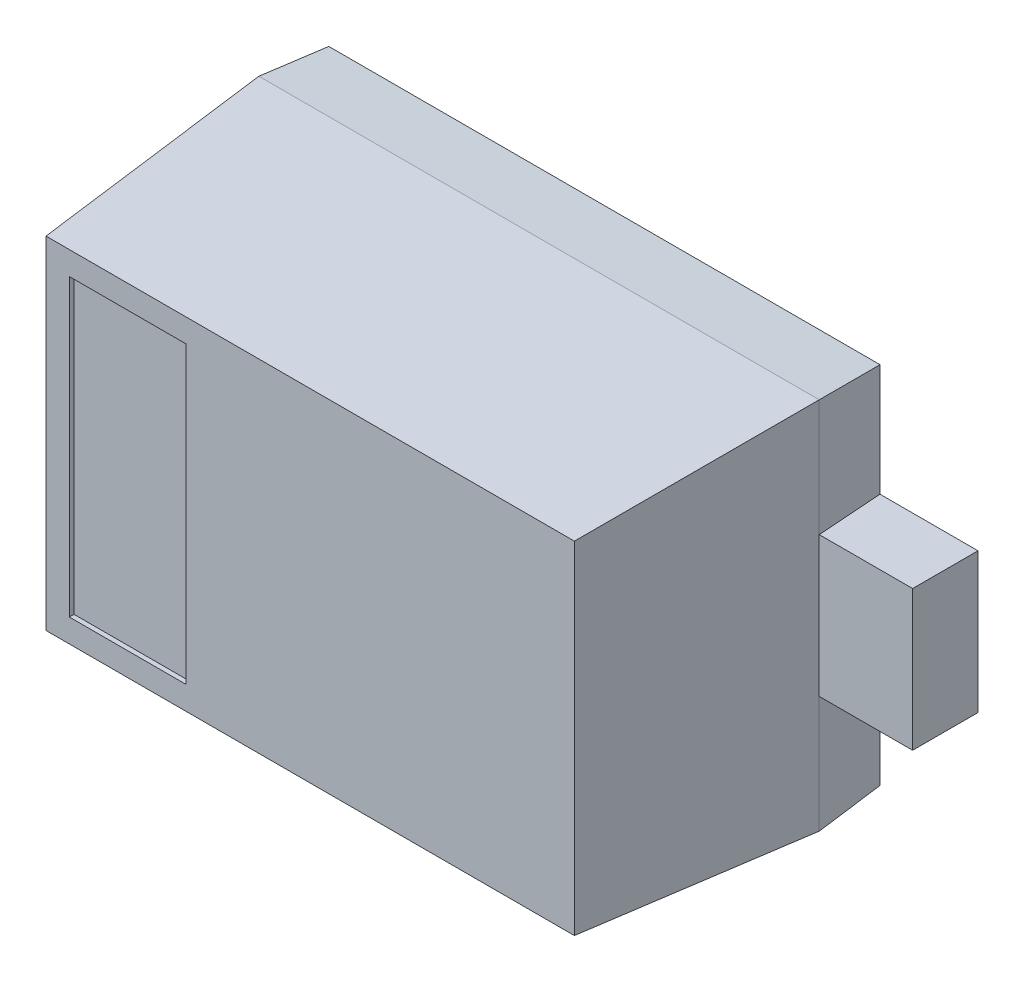
ISO-10303-21;
HEADER;
FILE_DESCRIPTION(('STEP AP214'),'2;1');
FILE_NAME('part.step','',(''),(''),'','','');
FILE_SCHEMA(('AUTOMOTIVE_DESIGN { 1 0 10303 214 1 1 1 1 }'));
ENDSEC;
DATA;
#1=APPLICATION_CONTEXT('core data for automotive mechanical design processes');
#2=APPLICATION_PROTOCOL_DEFINITION('international standard','automotive_design',2000,#1);
#3=PRODUCT_CONTEXT('',#1,'mechanical');
#4=PRODUCT('Part','Part','',(#3));
#5=PRODUCT_RELATED_PRODUCT_CATEGORY('part','',(#4));
#6=PRODUCT_DEFINITION_FORMATION('','',#4);
#7=PRODUCT_DEFINITION_CONTEXT('part definition',#1,'design');
#8=PRODUCT_DEFINITION('design','',#6,#7);
#9=PRODUCT_DEFINITION_SHAPE('','',#8);
#10=(LENGTH_UNIT() NAMED_UNIT(*) SI_UNIT(.MILLI.,.METRE.));
#11=(NAMED_UNIT(*) PLANE_ANGLE_UNIT() SI_UNIT($,.RADIAN.));
#12=(NAMED_UNIT(*) SI_UNIT($,.STERADIAN.) SOLID_ANGLE_UNIT());
#13=UNCERTAINTY_MEASURE_WITH_UNIT(LENGTH_MEASURE(1.E-05),#10,'distance_accuracy_value','');
#14=(GEOMETRIC_REPRESENTATION_CONTEXT(3) GLOBAL_UNCERTAINTY_ASSIGNED_CONTEXT((#13)) GLOBAL_UNIT_ASSIGNED_CONTEXT((#10,
#11,#12)) REPRESENTATION_CONTEXT('',''));
#15=CARTESIAN_POINT('',(0.,0.,0.));
#16=DIRECTION('',(0.,0.,1.));
#17=DIRECTION('',(1.,0.,0.));
#18=AXIS2_PLACEMENT_3D('',#15,#16,#17);
#19=CARTESIAN_POINT('',(-0.515735862148,-0.315735862148,0.62));
#20=DIRECTION('',(0.,0.,1.));
#21=DIRECTION('',(1.,0.,0.));
#22=AXIS2_PLACEMENT_3D('',#19,#20,#21);
#23=PLANE('',#22);
#24=DIRECTION('',(0.,1.,0.));
#25=VECTOR('',#24,1.);
#26=CARTESIAN_POINT('',(-0.265735862148,-0.315735862148,0.62));
#27=LINE('',#26,#25);
#28=CARTESIAN_POINT('',(-0.265735862148,-0.315735862148,0.62));
#29=VERTEX_POINT('',#28);
#30=CARTESIAN_POINT('',(-0.265735862148,0.315735862148,0.62));
#31=VERTEX_POINT('',#30);
#32=EDGE_CURVE('E133',#29,#31,#27,.T.);
#33=ORIENTED_EDGE('',*,*,#32,.T.);
#34=DIRECTION('',(1.,0.,0.));
#35=VECTOR('',#34,1.);
#36=CARTESIAN_POINT('',(-0.515735862148,0.315735862148,0.62));
#37=LINE('',#36,#35);
#38=CARTESIAN_POINT('',(-0.515735862148,0.315735862148,0.62));
#39=VERTEX_POINT('',#38);
#40=EDGE_CURVE('E130',#31,#39,#37,.F.);
#41=ORIENTED_EDGE('',*,*,#40,.T.);
#42=DIRECTION('',(0.,1.,0.));
#43=VECTOR('',#42,1.);
#44=CARTESIAN_POINT('',(-0.515735862148,-0.315735862148,0.62));
#45=LINE('',#44,#43);
#46=CARTESIAN_POINT('',(-0.515735862148,-0.315735862148,0.62));
#47=VERTEX_POINT('',#46);
#48=EDGE_CURVE('E152',#47,#39,#45,.T.);
#49=ORIENTED_EDGE('',*,*,#48,.F.);
#50=DIRECTION('',(1.,0.,0.));
#51=VECTOR('',#50,1.);
#52=CARTESIAN_POINT('',(-0.515735862148,-0.315735862148,0.62));
#53=LINE('',#52,#51);
#54=EDGE_CURVE('E136',#29,#47,#53,.F.);
#55=ORIENTED_EDGE('',*,*,#54,.F.);
#56=EDGE_LOOP('',(#33,#41,#49,#55));
#57=FACE_BOUND('',#56,.T.);
#58=ADVANCED_FACE('F16',(#57),#23,.T.);
#59=CARTESIAN_POINT('',(-0.265735862148,-0.315735862148,0.62));
#60=DIRECTION('',(1.,0.,0.));
#61=DIRECTION('',(0.,0.,-1.));
#62=AXIS2_PLACEMENT_3D('',#59,#60,#61);
#63=PLANE('',#62);
#64=DIRECTION('',(0.,0.,1.));
#65=VECTOR('',#64,1.);
#66=CARTESIAN_POINT('',(-0.265735862148,0.315735862148,0.62));
#67=LINE('',#66,#65);
#68=CARTESIAN_POINT('',(-0.265735862148,0.315735862148,0.63));
#69=VERTEX_POINT('',#68);
#70=EDGE_CURVE('E139',#69,#31,#67,.F.);
#71=ORIENTED_EDGE('',*,*,#70,.T.);
#72=ORIENTED_EDGE('',*,*,#32,.F.);
#73=DIRECTION('',(0.,0.,1.));
#74=VECTOR('',#73,1.);
#75=CARTESIAN_POINT('',(-0.265735862148,-0.315735862148,0.62));
#76=LINE('',#75,#74);
#77=CARTESIAN_POINT('',(-0.265735862148,-0.315735862148,0.63));
#78=VERTEX_POINT('',#77);
#79=EDGE_CURVE('E231',#78,#29,#76,.F.);
#80=ORIENTED_EDGE('',*,*,#79,.F.);
#81=DIRECTION('',(0.,1.,0.));
#82=VECTOR('',#81,1.);
#83=CARTESIAN_POINT('',(-0.265735862148,-0.365735862148,0.63));
#84=LINE('',#83,#82);
#85=EDGE_CURVE('E144',#78,#69,#84,.T.);
#86=ORIENTED_EDGE('',*,*,#85,.T.);
#87=EDGE_LOOP('',(#71,#72,#80,#86));
#88=FACE_BOUND('',#87,.T.);
#89=ADVANCED_FACE('F142',(#88),#63,.F.);
#90=CARTESIAN_POINT('',(-0.515735862148,0.315735862148,0.62));
#91=DIRECTION('',(0.,1.,0.));
#92=DIRECTION('',(0.,0.,1.));
#93=AXIS2_PLACEMENT_3D('',#90,#91,#92);
#94=PLANE('',#93);
#95=DIRECTION('',(0.,0.,-1.));
#96=VECTOR('',#95,1.);
#97=CARTESIAN_POINT('',(-0.515735862148,0.315735862148,0.62));
#98=LINE('',#97,#96);
#99=CARTESIAN_POINT('',(-0.515735862148,0.315735862148,0.63));
#100=VERTEX_POINT('',#99);
#101=EDGE_CURVE('E150',#39,#100,#98,.F.);
#102=ORIENTED_EDGE('',*,*,#101,.F.);
#103=ORIENTED_EDGE('',*,*,#40,.F.);
#104=ORIENTED_EDGE('',*,*,#70,.F.);
#105=DIRECTION('',(-1.,0.,0.));
#106=VECTOR('',#105,1.);
#107=CARTESIAN_POINT('',(-0.565735862148,0.315735862148,0.63));
#108=LINE('',#107,#106);
#109=EDGE_CURVE('E203',#69,#100,#108,.T.);
#110=ORIENTED_EDGE('',*,*,#109,.T.);
#111=EDGE_LOOP('',(#102,#103,#104,#110));
#112=FACE_BOUND('',#111,.T.);
#113=ADVANCED_FACE('F148',(#112),#94,.F.);
#114=CARTESIAN_POINT('',(-0.515735862148,-0.315735862148,0.62));
#115=DIRECTION('',(1.,0.,0.));
#116=DIRECTION('',(0.,0.,-1.));
#117=AXIS2_PLACEMENT_3D('',#114,#115,#116);
#118=PLANE('',#117);
#119=ORIENTED_EDGE('',*,*,#101,.T.);
#120=DIRECTION('',(0.,1.,0.));
#121=VECTOR('',#120,1.);
#122=CARTESIAN_POINT('',(-0.515735862148,-0.365735862148,0.63));
#123=LINE('',#122,#121);
#124=CARTESIAN_POINT('',(-0.515735862148,-0.315735862148,0.63));
#125=VERTEX_POINT('',#124);
#126=EDGE_CURVE('E201',#100,#125,#123,.F.);
#127=ORIENTED_EDGE('',*,*,#126,.T.);
#128=DIRECTION('',(0.,0.,1.));
#129=VECTOR('',#128,1.);
#130=CARTESIAN_POINT('',(-0.515735862148,-0.315735862148,0.62));
#131=LINE('',#130,#129);
#132=EDGE_CURVE('E206',#47,#125,#131,.T.);
#133=ORIENTED_EDGE('',*,*,#132,.F.);
#134=ORIENTED_EDGE('',*,*,#48,.T.);
#135=EDGE_LOOP('',(#119,#127,#133,#134));
#136=FACE_BOUND('',#135,.T.);
#137=ADVANCED_FACE('F234',(#136),#118,.T.);
#138=CARTESIAN_POINT('',(-0.515735862148,-0.315735862148,0.62));
#139=DIRECTION('',(0.,1.,0.));
#140=DIRECTION('',(0.,0.,1.));
#141=AXIS2_PLACEMENT_3D('',#138,#139,#140);
#142=PLANE('',#141);
#143=ORIENTED_EDGE('',*,*,#132,.T.);
#144=DIRECTION('',(-1.,0.,0.));
#145=VECTOR('',#144,1.);
#146=CARTESIAN_POINT('',(-0.565735862148,-0.315735862148,0.63));
#147=LINE('',#146,#145);
#148=EDGE_CURVE('E198',#125,#78,#147,.F.);
#149=ORIENTED_EDGE('',*,*,#148,.T.);
#150=ORIENTED_EDGE('',*,*,#79,.T.);
#151=ORIENTED_EDGE('',*,*,#54,.T.);
#152=EDGE_LOOP('',(#143,#149,#150,#151));
#153=FACE_BOUND('',#152,.T.);
#154=ADVANCED_FACE('F240',(#153),#142,.T.);
#155=CARTESIAN_POINT('',(-0.590210246328,0.15,0.14));
#156=DIRECTION('',(0.,0.,1.));
#157=DIRECTION('',(1.,0.,0.));
#158=AXIS2_PLACEMENT_3D('',#155,#156,#157);
#159=PLANE('',#158);
#160=DIRECTION('',(0.,-1.,0.));
#161=VECTOR('',#160,1.);
#162=CARTESIAN_POINT('',(-0.8,0.15,0.14));
#163=LINE('',#162,#161);
#164=CARTESIAN_POINT('',(-0.8,-0.15,0.14));
#165=VERTEX_POINT('',#164);
#166=CARTESIAN_POINT('',(-0.8,0.15,0.14));
#167=VERTEX_POINT('',#166);
#168=EDGE_CURVE('E194',#165,#167,#163,.F.);
#169=ORIENTED_EDGE('',*,*,#168,.F.);
#170=DIRECTION('',(1.,0.,0.));
#171=VECTOR('',#170,1.);
#172=CARTESIAN_POINT('',(-0.590210246328,-0.15,0.14));
#173=LINE('',#172,#171);
#174=CARTESIAN_POINT('',(-0.6,-0.15,0.14));
#175=VERTEX_POINT('',#174);
#176=EDGE_CURVE('E68',#175,#165,#173,.F.);
#177=ORIENTED_EDGE('',*,*,#176,.F.);
#178=DIRECTION('',(0.,-1.,0.));
#179=VECTOR('',#178,1.);
#180=CARTESIAN_POINT('',(-0.6,0.,0.14));
#181=LINE('',#180,#179);
#182=CARTESIAN_POINT('',(-0.6,0.15,0.14));
#183=VERTEX_POINT('',#182);
#184=EDGE_CURVE('E319',#183,#175,#181,.T.);
#185=ORIENTED_EDGE('',*,*,#184,.F.);
#186=DIRECTION('',(1.,0.,0.));
#187=VECTOR('',#186,1.);
#188=CARTESIAN_POINT('',(-0.590210246328,0.15,0.14));
#189=LINE('',#188,#187);
#190=EDGE_CURVE('E225',#183,#167,#189,.F.);
#191=ORIENTED_EDGE('',*,*,#190,.T.);
#192=EDGE_LOOP('',(#169,#177,#185,#191));
#193=FACE_BOUND('',#192,.T.);
#194=ADVANCED_FACE('F242',(#193),#159,.T.);
#195=CARTESIAN_POINT('',(0.590210246328,-0.15,0.14));
#196=DIRECTION('',(0.,0.,1.));
#197=DIRECTION('',(1.,0.,0.));
#198=AXIS2_PLACEMENT_3D('',#195,#196,#197);
#199=PLANE('',#198);
#200=DIRECTION('',(0.,1.,0.));
#201=VECTOR('',#200,1.);
#202=CARTESIAN_POINT('',(0.8,-0.15,0.14));
#203=LINE('',#202,#201);
#204=CARTESIAN_POINT('',(0.8,0.15,0.14));
#205=VERTEX_POINT('',#204);
#206=CARTESIAN_POINT('',(0.8,-0.15,0.14));
#207=VERTEX_POINT('',#206);
#208=EDGE_CURVE('E207',#205,#207,#203,.F.);
#209=ORIENTED_EDGE('',*,*,#208,.F.);
#210=DIRECTION('',(-1.,0.,0.));
#211=VECTOR('',#210,1.);
#212=CARTESIAN_POINT('',(0.590210246328,0.15,0.14));
#213=LINE('',#212,#211);
#214=CARTESIAN_POINT('',(0.6,0.15,0.14));
#215=VERTEX_POINT('',#214);
#216=EDGE_CURVE('E210',#215,#205,#213,.F.);
#217=ORIENTED_EDGE('',*,*,#216,.F.);
#218=DIRECTION('',(0.,1.,0.));
#219=VECTOR('',#218,1.);
#220=CARTESIAN_POINT('',(0.6,0.,0.14));
#221=LINE('',#220,#219);
#222=CARTESIAN_POINT('',(0.6,-0.15,0.14));
#223=VERTEX_POINT('',#222);
#224=EDGE_CURVE('E396',#223,#215,#221,.T.);
#225=ORIENTED_EDGE('',*,*,#224,.F.);
#226=DIRECTION('',(-1.,0.,0.));
#227=VECTOR('',#226,1.);
#228=CARTESIAN_POINT('',(0.590210246328,-0.15,0.14));
#229=LINE('',#228,#227);
#230=EDGE_CURVE('E217',#223,#207,#229,.F.);
#231=ORIENTED_EDGE('',*,*,#230,.T.);
#232=EDGE_LOOP('',(#209,#217,#225,#231));
#233=FACE_BOUND('',#232,.T.);
#234=ADVANCED_FACE('F249',(#233),#199,.T.);
#235=CARTESIAN_POINT('',(-0.565735862148,-0.365735862148,0.63));
#236=DIRECTION('',(0.,0.,-1.));
#237=DIRECTION('',(-1.,0.,0.));
#238=AXIS2_PLACEMENT_3D('',#235,#236,#237);
#239=PLANE('',#238);
#240=ORIENTED_EDGE('',*,*,#126,.F.);
#241=ORIENTED_EDGE('',*,*,#109,.F.);
#242=ORIENTED_EDGE('',*,*,#85,.F.);
#243=ORIENTED_EDGE('',*,*,#148,.F.);
#244=EDGE_LOOP('',(#240,#241,#242,#243));
#245=FACE_BOUND('',#244,.T.);
#246=DIRECTION('',(1.,0.,0.));
#247=VECTOR('',#246,1.);
#248=CARTESIAN_POINT('',(0.,0.365735862148,0.63));
#249=LINE('',#248,#247);
#250=CARTESIAN_POINT('',(-0.565735862148,0.365735862148,0.63));
#251=VERTEX_POINT('',#250);
#252=CARTESIAN_POINT('',(0.565735862148,0.365735862148,0.63));
#253=VERTEX_POINT('',#252);
#254=EDGE_CURVE('E211',#251,#253,#249,.T.);
#255=ORIENTED_EDGE('',*,*,#254,.F.);
#256=DIRECTION('',(0.,1.,0.));
#257=VECTOR('',#256,1.);
#258=CARTESIAN_POINT('',(-0.565735862148,0.,0.63));
#259=LINE('',#258,#257);
#260=CARTESIAN_POINT('',(-0.565735862148,-0.365735862148,0.63));
#261=VERTEX_POINT('',#260);
#262=EDGE_CURVE('E314',#261,#251,#259,.T.);
#263=ORIENTED_EDGE('',*,*,#262,.F.);
#264=DIRECTION('',(-1.,0.,0.));
#265=VECTOR('',#264,1.);
#266=CARTESIAN_POINT('',(0.,-0.365735862148,0.63));
#267=LINE('',#266,#265);
#268=CARTESIAN_POINT('',(0.565735862148,-0.365735862148,0.63));
#269=VERTEX_POINT('',#268);
#270=EDGE_CURVE('E80',#269,#261,#267,.T.);
#271=ORIENTED_EDGE('',*,*,#270,.F.);
#272=DIRECTION('',(0.,-1.,0.));
#273=VECTOR('',#272,1.);
#274=CARTESIAN_POINT('',(0.565735862148,0.,0.63));
#275=LINE('',#274,#273);
#276=EDGE_CURVE('E390',#253,#269,#275,.T.);
#277=ORIENTED_EDGE('',*,*,#276,.F.);
#278=EDGE_LOOP('',(#255,#263,#271,#277));
#279=FACE_BOUND('',#278,.T.);
#280=ADVANCED_FACE('F238',(#245,#279),#239,.F.);
#281=CARTESIAN_POINT('',(-0.6,-0.4,0.14));
#282=DIRECTION('',(0.,-0.99756405025987,0.0697564737434768));
#283=DIRECTION('',(1.,0.,0.));
#284=AXIS2_PLACEMENT_3D('',#281,#282,#283);
#285=PLANE('',#284);
#286=ORIENTED_EDGE('',*,*,#270,.T.);
#287=DIRECTION('',(0.0695873743160209,0.0695873743160209,0.995145815783599));
#288=VECTOR('',#287,1.);
#289=CARTESIAN_POINT('',(-0.582867931074,-0.382867931074,0.385));
#290=LINE('',#289,#288);
#291=CARTESIAN_POINT('',(-0.6,-0.4,0.14));
#292=VERTEX_POINT('',#291);
#293=EDGE_CURVE('E316',#292,#261,#290,.T.);
#294=ORIENTED_EDGE('',*,*,#293,.F.);
#295=DIRECTION('',(-1.,0.,0.));
#296=VECTOR('',#295,1.);
#297=CARTESIAN_POINT('',(0.,-0.4,0.14));
#298=LINE('',#297,#296);
#299=CARTESIAN_POINT('',(0.6,-0.4,0.14));
#300=VERTEX_POINT('',#299);
#301=EDGE_CURVE('E384',#300,#292,#298,.T.);
#302=ORIENTED_EDGE('',*,*,#301,.F.);
#303=DIRECTION('',(0.0695873743160209,-0.0695873743160209,-0.995145815783599));
#304=VECTOR('',#303,1.);
#305=CARTESIAN_POINT('',(0.582867931074,-0.382867931074,0.385));
#306=LINE('',#305,#304);
#307=EDGE_CURVE('E387',#269,#300,#306,.T.);
#308=ORIENTED_EDGE('',*,*,#307,.F.);
#309=EDGE_LOOP('',(#286,#294,#302,#308));
#310=FACE_BOUND('',#309,.T.);
#311=ADVANCED_FACE('F287',(#310),#285,.T.);
#312=CARTESIAN_POINT('',(-0.8,0.15,0.));
#313=DIRECTION('',(-1.,0.,0.));
#314=DIRECTION('',(0.,-1.,0.));
#315=AXIS2_PLACEMENT_3D('',#312,#313,#314);
#316=PLANE('',#315);
#317=DIRECTION('',(0.,0.,1.));
#318=VECTOR('',#317,1.);
#319=CARTESIAN_POINT('',(-0.8,-0.15,0.));
#320=LINE('',#319,#318);
#321=CARTESIAN_POINT('',(-0.8,-0.15,0.));
#322=VERTEX_POINT('',#321);
#323=EDGE_CURVE('E193',#165,#322,#320,.F.);
#324=ORIENTED_EDGE('',*,*,#323,.F.);
#325=ORIENTED_EDGE('',*,*,#168,.T.);
#326=DIRECTION('',(0.,0.,1.));
#327=VECTOR('',#326,1.);
#328=CARTESIAN_POINT('',(-0.8,0.15,0.));
#329=LINE('',#328,#327);
#330=CARTESIAN_POINT('',(-0.8,0.15,0.));
#331=VERTEX_POINT('',#330);
#332=EDGE_CURVE('E329',#167,#331,#329,.F.);
#333=ORIENTED_EDGE('',*,*,#332,.T.);
#334=DIRECTION('',(0.,1.,0.));
#335=VECTOR('',#334,1.);
#336=CARTESIAN_POINT('',(-0.8,0.15,0.));
#337=LINE('',#336,#335);
#338=EDGE_CURVE('E174',#331,#322,#337,.F.);
#339=ORIENTED_EDGE('',*,*,#338,.T.);
#340=EDGE_LOOP('',(#324,#325,#333,#339));
#341=FACE_BOUND('',#340,.T.);
#342=ADVANCED_FACE('F284',(#341),#316,.T.);
#343=CARTESIAN_POINT('',(-0.590210246328,-0.15,0.));
#344=DIRECTION('',(0.,-1.,0.));
#345=DIRECTION('',(1.,0.,0.));
#346=AXIS2_PLACEMENT_3D('',#343,#344,#345);
#347=PLANE('',#346);
#348=ORIENTED_EDGE('',*,*,#176,.T.);
#349=ORIENTED_EDGE('',*,*,#323,.T.);
#350=DIRECTION('',(1.,0.,0.));
#351=VECTOR('',#350,1.);
#352=CARTESIAN_POINT('',(-0.590210246328,-0.15,0.));
#353=LINE('',#352,#351);
#354=CARTESIAN_POINT('',(-0.590210246328,-0.15,0.));
#355=VERTEX_POINT('',#354);
#356=EDGE_CURVE('E167',#322,#355,#353,.T.);
#357=ORIENTED_EDGE('',*,*,#356,.T.);
#358=DIRECTION('',(-0.0697564737434759,0.,0.99756405025987));
#359=VECTOR('',#358,1.);
#360=CARTESIAN_POINT('',(-0.590210246328,-0.15,0.));
#361=LINE('',#360,#359);
#362=EDGE_CURVE('E20',#175,#355,#361,.F.);
#363=ORIENTED_EDGE('',*,*,#362,.F.);
#364=EDGE_LOOP('',(#348,#349,#357,#363));
#365=FACE_BOUND('',#364,.T.);
#366=ADVANCED_FACE('F280',(#365),#347,.T.);
#367=CARTESIAN_POINT('',(-0.590210246328,0.15,0.));
#368=DIRECTION('',(0.,-1.,0.));
#369=DIRECTION('',(1.,0.,0.));
#370=AXIS2_PLACEMENT_3D('',#367,#368,#369);
#371=PLANE('',#370);
#372=ORIENTED_EDGE('',*,*,#190,.F.);
#373=DIRECTION('',(-0.0697564737434759,0.,0.99756405025987));
#374=VECTOR('',#373,1.);
#375=CARTESIAN_POINT('',(-0.590210246328,0.15,0.));
#376=LINE('',#375,#374);
#377=CARTESIAN_POINT('',(-0.590210246328,0.15,0.));
#378=VERTEX_POINT('',#377);
#379=EDGE_CURVE('E164',#378,#183,#376,.T.);
#380=ORIENTED_EDGE('',*,*,#379,.F.);
#381=DIRECTION('',(1.,0.,0.));
#382=VECTOR('',#381,1.);
#383=CARTESIAN_POINT('',(-0.590210246328,0.15,0.));
#384=LINE('',#383,#382);
#385=EDGE_CURVE('E181',#378,#331,#384,.F.);
#386=ORIENTED_EDGE('',*,*,#385,.T.);
#387=ORIENTED_EDGE('',*,*,#332,.F.);
#388=EDGE_LOOP('',(#372,#380,#386,#387));
#389=FACE_BOUND('',#388,.T.);
#390=ADVANCED_FACE('F276',(#389),#371,.F.);
#391=CARTESIAN_POINT('',(-0.6,0.4,0.14));
#392=DIRECTION('',(-0.99756405025987,0.,0.0697564737434768));
#393=DIRECTION('',(0.,-1.,0.));
#394=AXIS2_PLACEMENT_3D('',#391,#392,#393);
#395=PLANE('',#394);
#396=ORIENTED_EDGE('',*,*,#262,.T.);
#397=DIRECTION('',(0.0695873743160209,-0.0695873743160209,0.995145815783599));
#398=VECTOR('',#397,1.);
#399=CARTESIAN_POINT('',(-0.582867931074,0.382867931074,0.385));
#400=LINE('',#399,#398);
#401=CARTESIAN_POINT('',(-0.6,0.4,0.14));
#402=VERTEX_POINT('',#401);
#403=EDGE_CURVE('E311',#402,#251,#400,.T.);
#404=ORIENTED_EDGE('',*,*,#403,.F.);
#405=DIRECTION('',(0.,1.,0.));
#406=VECTOR('',#405,1.);
#407=CARTESIAN_POINT('',(-0.6,0.,0.14));
#408=LINE('',#407,#406);
#409=EDGE_CURVE('E166',#183,#402,#408,.T.);
#410=ORIENTED_EDGE('',*,*,#409,.F.);
#411=ORIENTED_EDGE('',*,*,#184,.T.);
#412=DIRECTION('',(0.,1.,0.));
#413=VECTOR('',#412,1.);
#414=CARTESIAN_POINT('',(-0.6,0.,0.14));
#415=LINE('',#414,#413);
#416=EDGE_CURVE('E185',#292,#175,#415,.T.);
#417=ORIENTED_EDGE('',*,*,#416,.F.);
#418=ORIENTED_EDGE('',*,*,#293,.T.);
#419=EDGE_LOOP('',(#396,#404,#410,#411,#417,#418));
#420=FACE_BOUND('',#419,.T.);
#421=ADVANCED_FACE('F279',(#420),#395,.T.);
#422=CARTESIAN_POINT('',(0.6,0.4,0.14));
#423=DIRECTION('',(0.,0.99756405025987,0.0697564737434768));
#424=DIRECTION('',(-1.,0.,0.));
#425=AXIS2_PLACEMENT_3D('',#422,#423,#424);
#426=PLANE('',#425);
#427=ORIENTED_EDGE('',*,*,#254,.T.);
#428=DIRECTION('',(-0.0695873743160209,-0.0695873743160209,0.995145815783599));
#429=VECTOR('',#428,1.);
#430=CARTESIAN_POINT('',(0.582867931074,0.382867931074,0.385));
#431=LINE('',#430,#429);
#432=CARTESIAN_POINT('',(0.6,0.4,0.14));
#433=VERTEX_POINT('',#432);
#434=EDGE_CURVE('E393',#433,#253,#431,.T.);
#435=ORIENTED_EDGE('',*,*,#434,.F.);
#436=DIRECTION('',(1.,0.,0.));
#437=VECTOR('',#436,1.);
#438=CARTESIAN_POINT('',(0.,0.4,0.14));
#439=LINE('',#438,#437);
#440=EDGE_CURVE('E163',#402,#433,#439,.T.);
#441=ORIENTED_EDGE('',*,*,#440,.F.);
#442=ORIENTED_EDGE('',*,*,#403,.T.);
#443=EDGE_LOOP('',(#427,#435,#441,#442));
#444=FACE_BOUND('',#443,.T.);
#445=ADVANCED_FACE('F274',(#444),#426,.T.);
#446=CARTESIAN_POINT('',(0.8,-0.15,0.));
#447=DIRECTION('',(1.,0.,0.));
#448=DIRECTION('',(0.,1.,0.));
#449=AXIS2_PLACEMENT_3D('',#446,#447,#448);
#450=PLANE('',#449);
#451=DIRECTION('',(0.,0.,1.));
#452=VECTOR('',#451,1.);
#453=CARTESIAN_POINT('',(0.8,0.15,0.));
#454=LINE('',#453,#452);
#455=CARTESIAN_POINT('',(0.8,0.15,0.));
#456=VERTEX_POINT('',#455);
#457=EDGE_CURVE('E214',#205,#456,#454,.F.);
#458=ORIENTED_EDGE('',*,*,#457,.F.);
#459=ORIENTED_EDGE('',*,*,#208,.T.);
#460=DIRECTION('',(0.,0.,1.));
#461=VECTOR('',#460,1.);
#462=CARTESIAN_POINT('',(0.8,-0.15,0.));
#463=LINE('',#462,#461);
#464=CARTESIAN_POINT('',(0.8,-0.15,0.));
#465=VERTEX_POINT('',#464);
#466=EDGE_CURVE('E404',#207,#465,#463,.F.);
#467=ORIENTED_EDGE('',*,*,#466,.T.);
#468=DIRECTION('',(0.,1.,0.));
#469=VECTOR('',#468,1.);
#470=CARTESIAN_POINT('',(0.8,-0.15,0.));
#471=LINE('',#470,#469);
#472=EDGE_CURVE('E301',#465,#456,#471,.T.);
#473=ORIENTED_EDGE('',*,*,#472,.T.);
#474=EDGE_LOOP('',(#458,#459,#467,#473));
#475=FACE_BOUND('',#474,.T.);
#476=ADVANCED_FACE('F270',(#475),#450,.T.);
#477=CARTESIAN_POINT('',(0.590210246328,0.15,0.));
#478=DIRECTION('',(0.,1.,0.));
#479=DIRECTION('',(-1.,0.,0.));
#480=AXIS2_PLACEMENT_3D('',#477,#478,#479);
#481=PLANE('',#480);
#482=ORIENTED_EDGE('',*,*,#216,.T.);
#483=ORIENTED_EDGE('',*,*,#457,.T.);
#484=DIRECTION('',(1.,0.,0.));
#485=VECTOR('',#484,1.);
#486=CARTESIAN_POINT('',(0.590210246328,0.15,0.));
#487=LINE('',#486,#485);
#488=CARTESIAN_POINT('',(0.590210246328,0.149999999999999,0.));
#489=VERTEX_POINT('',#488);
#490=EDGE_CURVE('E377',#456,#489,#487,.F.);
#491=ORIENTED_EDGE('',*,*,#490,.T.);
#492=DIRECTION('',(0.0697564737434759,0.,0.99756405025987));
#493=VECTOR('',#492,1.);
#494=CARTESIAN_POINT('',(0.590210246328,0.15,0.));
#495=LINE('',#494,#493);
#496=EDGE_CURVE('E160',#215,#489,#495,.F.);
#497=ORIENTED_EDGE('',*,*,#496,.F.);
#498=EDGE_LOOP('',(#482,#483,#491,#497));
#499=FACE_BOUND('',#498,.T.);
#500=ADVANCED_FACE('F267',(#499),#481,.T.);
#501=CARTESIAN_POINT('',(0.590210246328,-0.15,0.));
#502=DIRECTION('',(0.,1.,0.));
#503=DIRECTION('',(-1.,0.,0.));
#504=AXIS2_PLACEMENT_3D('',#501,#502,#503);
#505=PLANE('',#504);
#506=ORIENTED_EDGE('',*,*,#230,.F.);
#507=DIRECTION('',(0.0697564737434759,0.,0.99756405025987));
#508=VECTOR('',#507,1.);
#509=CARTESIAN_POINT('',(0.590210246328,-0.15,0.));
#510=LINE('',#509,#508);
#511=CARTESIAN_POINT('',(0.590210246328,-0.15,0.));
#512=VERTEX_POINT('',#511);
#513=EDGE_CURVE('E35',#512,#223,#510,.T.);
#514=ORIENTED_EDGE('',*,*,#513,.F.);
#515=DIRECTION('',(1.,0.,0.));
#516=VECTOR('',#515,1.);
#517=CARTESIAN_POINT('',(0.590210246328,-0.15,0.));
#518=LINE('',#517,#516);
#519=EDGE_CURVE('E397',#512,#465,#518,.T.);
#520=ORIENTED_EDGE('',*,*,#519,.T.);
#521=ORIENTED_EDGE('',*,*,#466,.F.);
#522=EDGE_LOOP('',(#506,#514,#520,#521));
#523=FACE_BOUND('',#522,.T.);
#524=ADVANCED_FACE('F263',(#523),#505,.F.);
#525=CARTESIAN_POINT('',(0.6,-0.4,0.14));
#526=DIRECTION('',(0.99756405025987,0.,0.0697564737434768));
#527=DIRECTION('',(0.,1.,0.));
#528=AXIS2_PLACEMENT_3D('',#525,#526,#527);
#529=PLANE('',#528);
#530=ORIENTED_EDGE('',*,*,#276,.T.);
#531=ORIENTED_EDGE('',*,*,#307,.T.);
#532=DIRECTION('',(0.,-1.,0.));
#533=VECTOR('',#532,1.);
#534=CARTESIAN_POINT('',(0.6,0.,0.14));
#535=LINE('',#534,#533);
#536=EDGE_CURVE('E158',#223,#300,#535,.T.);
#537=ORIENTED_EDGE('',*,*,#536,.F.);
#538=ORIENTED_EDGE('',*,*,#224,.T.);
#539=DIRECTION('',(0.,-1.,0.));
#540=VECTOR('',#539,1.);
#541=CARTESIAN_POINT('',(0.6,0.,0.14));
#542=LINE('',#541,#540);
#543=EDGE_CURVE('E371',#433,#215,#542,.T.);
#544=ORIENTED_EDGE('',*,*,#543,.F.);
#545=ORIENTED_EDGE('',*,*,#434,.T.);
#546=EDGE_LOOP('',(#530,#531,#537,#538,#544,#545));
#547=FACE_BOUND('',#546,.T.);
#548=ADVANCED_FACE('F266',(#547),#529,.T.);
#549=CARTESIAN_POINT('',(-0.590210246328,-0.390210246328,0.));
#550=DIRECTION('',(0.,-0.99756405025987,-0.069756473743477));
#551=DIRECTION('',(1.,0.,0.));
#552=AXIS2_PLACEMENT_3D('',#549,#550,#551);
#553=PLANE('',#552);
#554=ORIENTED_EDGE('',*,*,#301,.T.);
#555=DIRECTION('',(-0.06958737431602,-0.0695873743160211,0.995145815783599));
#556=VECTOR('',#555,1.);
#557=CARTESIAN_POINT('',(-0.595105123164,-0.395105123164,0.07));
#558=LINE('',#557,#556);
#559=CARTESIAN_POINT('',(-0.590210246328,-0.390210246328,0.));
#560=VERTEX_POINT('',#559);
#561=EDGE_CURVE('E381',#560,#292,#558,.T.);
#562=ORIENTED_EDGE('',*,*,#561,.F.);
#563=DIRECTION('',(-1.,0.,0.));
#564=VECTOR('',#563,1.);
#565=CARTESIAN_POINT('',(-0.590210246328,-0.390210246328,0.));
#566=LINE('',#565,#564);
#567=CARTESIAN_POINT('',(0.590210246328,-0.390210246328,0.));
#568=VERTEX_POINT('',#567);
#569=EDGE_CURVE('E191',#568,#560,#566,.T.);
#570=ORIENTED_EDGE('',*,*,#569,.F.);
#571=DIRECTION('',(-0.06958737431602,0.0695873743160211,-0.995145815783599));
#572=VECTOR('',#571,1.);
#573=CARTESIAN_POINT('',(0.595105123164,-0.395105123164,0.07));
#574=LINE('',#573,#572);
#575=EDGE_CURVE('E159',#300,#568,#574,.T.);
#576=ORIENTED_EDGE('',*,*,#575,.F.);
#577=EDGE_LOOP('',(#554,#562,#570,#576));
#578=FACE_BOUND('',#577,.T.);
#579=ADVANCED_FACE('F418',(#578),#553,.T.);
#580=CARTESIAN_POINT('',(-0.590210246328,0.390210246328,0.));
#581=DIRECTION('',(-0.99756405025987,0.,-0.0697564737434759));
#582=DIRECTION('',(0.,-1.,0.));
#583=AXIS2_PLACEMENT_3D('',#580,#581,#582);
#584=PLANE('',#583);
#585=ORIENTED_EDGE('',*,*,#561,.T.);
#586=ORIENTED_EDGE('',*,*,#416,.T.);
#587=ORIENTED_EDGE('',*,*,#362,.T.);
#588=DIRECTION('',(0.,1.,0.));
#589=VECTOR('',#588,1.);
#590=CARTESIAN_POINT('',(-0.590210246328,-0.390210246328,0.));
#591=LINE('',#590,#589);
#592=EDGE_CURVE('E187',#560,#355,#591,.T.);
#593=ORIENTED_EDGE('',*,*,#592,.F.);
#594=EDGE_LOOP('',(#585,#586,#587,#593));
#595=FACE_BOUND('',#594,.T.);
#596=ADVANCED_FACE('F427',(#595),#584,.T.);
#597=CARTESIAN_POINT('',(-0.590210246328,0.390210246328,0.));
#598=DIRECTION('',(-0.99756405025987,0.,-0.0697564737434759));
#599=DIRECTION('',(0.,-1.,0.));
#600=AXIS2_PLACEMENT_3D('',#597,#598,#599);
#601=PLANE('',#600);
#602=ORIENTED_EDGE('',*,*,#379,.T.);
#603=ORIENTED_EDGE('',*,*,#409,.T.);
#604=DIRECTION('',(-0.06958737431602,0.0695873743160211,0.995145815783599));
#605=VECTOR('',#604,1.);
#606=CARTESIAN_POINT('',(-0.595105123164,0.395105123164,0.07));
#607=LINE('',#606,#605);
#608=CARTESIAN_POINT('',(-0.590210246328,0.390210246328,0.));
#609=VERTEX_POINT('',#608);
#610=EDGE_CURVE('E171',#609,#402,#607,.T.);
#611=ORIENTED_EDGE('',*,*,#610,.F.);
#612=DIRECTION('',(0.,1.,0.));
#613=VECTOR('',#612,1.);
#614=CARTESIAN_POINT('',(-0.590210246328,-0.390210246328,0.));
#615=LINE('',#614,#613);
#616=EDGE_CURVE('E190',#378,#609,#615,.T.);
#617=ORIENTED_EDGE('',*,*,#616,.F.);
#618=EDGE_LOOP('',(#602,#603,#611,#617));
#619=FACE_BOUND('',#618,.T.);
#620=ADVANCED_FACE('F429',(#619),#601,.T.);
#621=CARTESIAN_POINT('',(0.590210246328,0.390210246328,0.));
#622=DIRECTION('',(0.,0.99756405025987,-0.069756473743477));
#623=DIRECTION('',(-1.,0.,0.));
#624=AXIS2_PLACEMENT_3D('',#621,#622,#623);
#625=PLANE('',#624);
#626=ORIENTED_EDGE('',*,*,#440,.T.);
#627=DIRECTION('',(0.06958737431602,0.0695873743160211,0.995145815783599));
#628=VECTOR('',#627,1.);
#629=CARTESIAN_POINT('',(0.595105123164,0.395105123164,0.07));
#630=LINE('',#629,#628);
#631=CARTESIAN_POINT('',(0.590210246328,0.390210246328,0.));
#632=VERTEX_POINT('',#631);
#633=EDGE_CURVE('E162',#632,#433,#630,.T.);
#634=ORIENTED_EDGE('',*,*,#633,.F.);
#635=DIRECTION('',(-1.,0.,0.));
#636=VECTOR('',#635,1.);
#637=CARTESIAN_POINT('',(-0.590210246328,0.390210246328,0.));
#638=LINE('',#637,#636);
#639=EDGE_CURVE('E325',#609,#632,#638,.F.);
#640=ORIENTED_EDGE('',*,*,#639,.F.);
#641=ORIENTED_EDGE('',*,*,#610,.T.);
#642=EDGE_LOOP('',(#626,#634,#640,#641));
#643=FACE_BOUND('',#642,.T.);
#644=ADVANCED_FACE('F364',(#643),#625,.T.);
#645=CARTESIAN_POINT('',(0.590210246328,-0.390210246328,0.));
#646=DIRECTION('',(0.99756405025987,0.,-0.0697564737434759));
#647=DIRECTION('',(0.,1.,0.));
#648=AXIS2_PLACEMENT_3D('',#645,#646,#647);
#649=PLANE('',#648);
#650=ORIENTED_EDGE('',*,*,#633,.T.);
#651=ORIENTED_EDGE('',*,*,#543,.T.);
#652=ORIENTED_EDGE('',*,*,#496,.T.);
#653=DIRECTION('',(0.,1.,0.));
#654=VECTOR('',#653,1.);
#655=CARTESIAN_POINT('',(0.590210246328,-0.390210246328,0.));
#656=LINE('',#655,#654);
#657=EDGE_CURVE('E26',#632,#489,#656,.F.);
#658=ORIENTED_EDGE('',*,*,#657,.F.);
#659=EDGE_LOOP('',(#650,#651,#652,#658));
#660=FACE_BOUND('',#659,.T.);
#661=ADVANCED_FACE('F259',(#660),#649,.T.);
#662=CARTESIAN_POINT('',(0.590210246328,-0.390210246328,0.));
#663=DIRECTION('',(0.99756405025987,0.,-0.0697564737434759));
#664=DIRECTION('',(0.,1.,0.));
#665=AXIS2_PLACEMENT_3D('',#662,#663,#664);
#666=PLANE('',#665);
#667=ORIENTED_EDGE('',*,*,#513,.T.);
#668=ORIENTED_EDGE('',*,*,#536,.T.);
#669=ORIENTED_EDGE('',*,*,#575,.T.);
#670=DIRECTION('',(0.,1.,0.));
#671=VECTOR('',#670,1.);
#672=CARTESIAN_POINT('',(0.590210246328,-0.390210246328,0.));
#673=LINE('',#672,#671);
#674=EDGE_CURVE('E11',#512,#568,#673,.F.);
#675=ORIENTED_EDGE('',*,*,#674,.F.);
#676=EDGE_LOOP('',(#667,#668,#669,#675));
#677=FACE_BOUND('',#676,.T.);
#678=ADVANCED_FACE('F18',(#677),#666,.T.);
#679=CARTESIAN_POINT('',(-0.590210246328,-0.390210246328,0.));
#680=DIRECTION('',(0.,0.,-1.));
#681=DIRECTION('',(-1.,0.,0.));
#682=AXIS2_PLACEMENT_3D('',#679,#680,#681);
#683=PLANE('',#682);
#684=ORIENTED_EDGE('',*,*,#657,.T.);
#685=ORIENTED_EDGE('',*,*,#490,.F.);
#686=ORIENTED_EDGE('',*,*,#472,.F.);
#687=ORIENTED_EDGE('',*,*,#519,.F.);
#688=ORIENTED_EDGE('',*,*,#674,.T.);
#689=ORIENTED_EDGE('',*,*,#569,.T.);
#690=ORIENTED_EDGE('',*,*,#592,.T.);
#691=ORIENTED_EDGE('',*,*,#356,.F.);
#692=ORIENTED_EDGE('',*,*,#338,.F.);
#693=ORIENTED_EDGE('',*,*,#385,.F.);
#694=ORIENTED_EDGE('',*,*,#616,.T.);
#695=ORIENTED_EDGE('',*,*,#639,.T.);
#696=EDGE_LOOP('',(#684,#685,#686,#687,#688,#689,#690,#691,#692,#693,#694,#695));
#697=FACE_BOUND('',#696,.T.);
#698=ADVANCED_FACE('F252',(#697),#683,.T.);
#699=CLOSED_SHELL('',(#58,#89,#113,#137,#154,#194,#234,#280,#311,#342,#366,#390,#421,#445,#476,
#500,#524,#548,#579,#596,#620,#644,#661,#678,#698));
#700=MANIFOLD_SOLID_BREP('B1',#699);
#701=ADVANCED_BREP_SHAPE_REPRESENTATION('',(#18,#700),#14);
#702=SHAPE_DEFINITION_REPRESENTATION(#9,#701);
ENDSEC;
END-ISO-10303-21;
